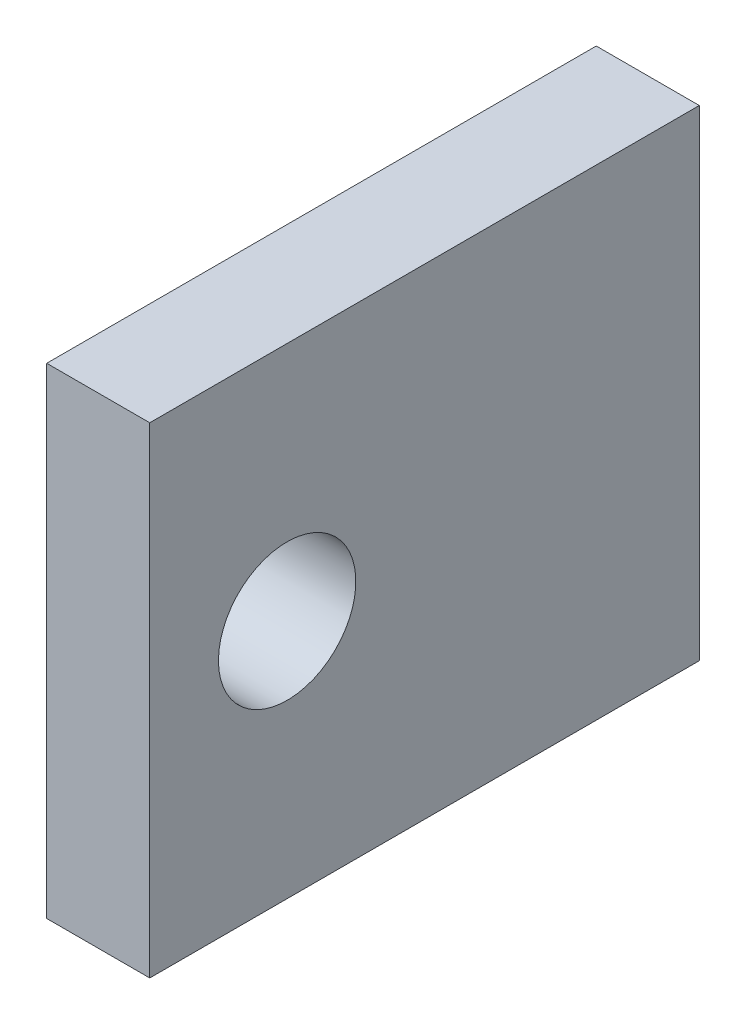
ISO-10303-21;
HEADER;
FILE_DESCRIPTION(('STEP AP214'),'2;1');
FILE_NAME('part.step','',(''),(''),'','','');
FILE_SCHEMA(('AUTOMOTIVE_DESIGN { 1 0 10303 214 1 1 1 1 }'));
ENDSEC;
DATA;
#1=APPLICATION_CONTEXT('core data for automotive mechanical design processes');
#2=APPLICATION_PROTOCOL_DEFINITION('international standard','automotive_design',2000,#1);
#3=PRODUCT_CONTEXT('',#1,'mechanical');
#4=PRODUCT('Part','Part','',(#3));
#5=PRODUCT_RELATED_PRODUCT_CATEGORY('part','',(#4));
#6=PRODUCT_DEFINITION_FORMATION('','',#4);
#7=PRODUCT_DEFINITION_CONTEXT('part definition',#1,'design');
#8=PRODUCT_DEFINITION('design','',#6,#7);
#9=PRODUCT_DEFINITION_SHAPE('','',#8);
#10=(LENGTH_UNIT() NAMED_UNIT(*) SI_UNIT(.MILLI.,.METRE.));
#11=(NAMED_UNIT(*) PLANE_ANGLE_UNIT() SI_UNIT($,.RADIAN.));
#12=(NAMED_UNIT(*) SI_UNIT($,.STERADIAN.) SOLID_ANGLE_UNIT());
#13=UNCERTAINTY_MEASURE_WITH_UNIT(LENGTH_MEASURE(1.E-05),#10,'distance_accuracy_value','');
#14=(GEOMETRIC_REPRESENTATION_CONTEXT(3) GLOBAL_UNCERTAINTY_ASSIGNED_CONTEXT((#13)) GLOBAL_UNIT_ASSIGNED_CONTEXT((#10,
#11,#12)) REPRESENTATION_CONTEXT('',''));
#15=CARTESIAN_POINT('',(0.,0.,0.));
#16=DIRECTION('',(0.,0.,1.));
#17=DIRECTION('',(1.,0.,0.));
#18=AXIS2_PLACEMENT_3D('',#15,#16,#17);
#19=CARTESIAN_POINT('',(9.525,0.,0.));
#20=DIRECTION('',(-1.,0.,0.));
#21=DIRECTION('',(0.,0.,1.));
#22=AXIS2_PLACEMENT_3D('',#19,#20,#21);
#23=PLANE('',#22);
#24=DIRECTION('',(0.,1.,0.));
#25=VECTOR('',#24,1.);
#26=CARTESIAN_POINT('',(9.525,-22.225,-25.4));
#27=LINE('',#26,#25);
#28=CARTESIAN_POINT('',(9.525,-22.225,-25.4));
#29=VERTEX_POINT('',#28);
#30=CARTESIAN_POINT('',(9.525,22.225,-25.4));
#31=VERTEX_POINT('',#30);
#32=EDGE_CURVE('E85',#29,#31,#27,.T.);
#33=ORIENTED_EDGE('',*,*,#32,.T.);
#34=DIRECTION('',(0.,0.,1.));
#35=VECTOR('',#34,1.);
#36=CARTESIAN_POINT('',(9.525,22.225,25.4));
#37=LINE('',#36,#35);
#38=CARTESIAN_POINT('',(9.525,22.225,25.4));
#39=VERTEX_POINT('',#38);
#40=EDGE_CURVE('E80',#31,#39,#37,.T.);
#41=ORIENTED_EDGE('',*,*,#40,.T.);
#42=DIRECTION('',(0.,-1.,0.));
#43=VECTOR('',#42,1.);
#44=CARTESIAN_POINT('',(9.525,-22.225,25.4));
#45=LINE('',#44,#43);
#46=CARTESIAN_POINT('',(9.525,-22.225,25.4));
#47=VERTEX_POINT('',#46);
#48=EDGE_CURVE('E83',#39,#47,#45,.T.);
#49=ORIENTED_EDGE('',*,*,#48,.T.);
#50=DIRECTION('',(0.,0.,-1.));
#51=VECTOR('',#50,1.);
#52=CARTESIAN_POINT('',(9.525,-22.225,25.4));
#53=LINE('',#52,#51);
#54=EDGE_CURVE('E50',#47,#29,#53,.T.);
#55=ORIENTED_EDGE('',*,*,#54,.T.);
#56=EDGE_LOOP('',(#33,#41,#49,#55));
#57=FACE_BOUND('',#56,.T.);
#58=CARTESIAN_POINT('',(9.525,0.,12.7));
#59=DIRECTION('',(1.,0.,0.));
#60=DIRECTION('',(0.,0.,-1.));
#61=AXIS2_PLACEMENT_3D('',#58,#59,#60);
#62=CIRCLE('',#61,6.35);
#63=CARTESIAN_POINT('',(9.525,0.,19.05));
#64=VERTEX_POINT('',#63);
#65=EDGE_CURVE('E100',#64,#64,#62,.T.);
#66=ORIENTED_EDGE('',*,*,#65,.F.);
#67=EDGE_LOOP('',(#66));
#68=FACE_BOUND('',#67,.T.);
#69=ADVANCED_FACE('F33',(#57,#68),#23,.F.);
#70=CARTESIAN_POINT('',(0.,0.,0.));
#71=DIRECTION('',(-1.,0.,0.));
#72=DIRECTION('',(0.,0.,1.));
#73=AXIS2_PLACEMENT_3D('',#70,#71,#72);
#74=PLANE('',#73);
#75=DIRECTION('',(0.,1.,0.));
#76=VECTOR('',#75,1.);
#77=CARTESIAN_POINT('',(0.,-22.225,-25.4));
#78=LINE('',#77,#76);
#79=CARTESIAN_POINT('',(0.,-22.225,-25.4));
#80=VERTEX_POINT('',#79);
#81=CARTESIAN_POINT('',(0.,22.225,-25.4));
#82=VERTEX_POINT('',#81);
#83=EDGE_CURVE('E97',#80,#82,#78,.T.);
#84=ORIENTED_EDGE('',*,*,#83,.F.);
#85=DIRECTION('',(0.,0.,-1.));
#86=VECTOR('',#85,1.);
#87=CARTESIAN_POINT('',(0.,-22.225,25.4));
#88=LINE('',#87,#86);
#89=CARTESIAN_POINT('',(0.,-22.225,25.4));
#90=VERTEX_POINT('',#89);
#91=EDGE_CURVE('E73',#90,#80,#88,.T.);
#92=ORIENTED_EDGE('',*,*,#91,.F.);
#93=DIRECTION('',(0.,-1.,0.));
#94=VECTOR('',#93,1.);
#95=CARTESIAN_POINT('',(0.,-22.225,25.4));
#96=LINE('',#95,#94);
#97=CARTESIAN_POINT('',(0.,22.225,25.4));
#98=VERTEX_POINT('',#97);
#99=EDGE_CURVE('E67',#98,#90,#96,.T.);
#100=ORIENTED_EDGE('',*,*,#99,.F.);
#101=DIRECTION('',(0.,0.,1.));
#102=VECTOR('',#101,1.);
#103=CARTESIAN_POINT('',(0.,22.225,25.4));
#104=LINE('',#103,#102);
#105=EDGE_CURVE('E89',#82,#98,#104,.T.);
#106=ORIENTED_EDGE('',*,*,#105,.F.);
#107=EDGE_LOOP('',(#84,#92,#100,#106));
#108=FACE_BOUND('',#107,.T.);
#109=CARTESIAN_POINT('',(0.,0.,12.7));
#110=DIRECTION('',(1.,0.,0.));
#111=DIRECTION('',(0.,0.,-1.));
#112=AXIS2_PLACEMENT_3D('',#109,#110,#111);
#113=CIRCLE('',#112,6.35);
#114=CARTESIAN_POINT('',(0.,0.,19.05));
#115=VERTEX_POINT('',#114);
#116=EDGE_CURVE('E112',#115,#115,#113,.T.);
#117=ORIENTED_EDGE('',*,*,#116,.T.);
#118=EDGE_LOOP('',(#117));
#119=FACE_BOUND('',#118,.T.);
#120=ADVANCED_FACE('F108',(#108,#119),#74,.T.);
#121=CARTESIAN_POINT('',(9.525,-22.225,-25.4));
#122=DIRECTION('',(0.,0.,1.));
#123=DIRECTION('',(1.,0.,0.));
#124=AXIS2_PLACEMENT_3D('',#121,#122,#123);
#125=PLANE('',#124);
#126=ORIENTED_EDGE('',*,*,#83,.T.);
#127=DIRECTION('',(-1.,0.,0.));
#128=VECTOR('',#127,1.);
#129=CARTESIAN_POINT('',(9.525,22.225,-25.4));
#130=LINE('',#129,#128);
#131=EDGE_CURVE('E11',#31,#82,#130,.T.);
#132=ORIENTED_EDGE('',*,*,#131,.F.);
#133=ORIENTED_EDGE('',*,*,#32,.F.);
#134=DIRECTION('',(-1.,0.,0.));
#135=VECTOR('',#134,1.);
#136=CARTESIAN_POINT('',(9.525,-22.225,-25.4));
#137=LINE('',#136,#135);
#138=EDGE_CURVE('E93',#29,#80,#137,.T.);
#139=ORIENTED_EDGE('',*,*,#138,.T.);
#140=EDGE_LOOP('',(#126,#132,#133,#139));
#141=FACE_BOUND('',#140,.T.);
#142=ADVANCED_FACE('F35',(#141),#125,.F.);
#143=CARTESIAN_POINT('',(9.525,22.225,25.4));
#144=DIRECTION('',(0.,-1.,0.));
#145=DIRECTION('',(0.,0.,-1.));
#146=AXIS2_PLACEMENT_3D('',#143,#144,#145);
#147=PLANE('',#146);
#148=ORIENTED_EDGE('',*,*,#105,.T.);
#149=DIRECTION('',(-1.,0.,0.));
#150=VECTOR('',#149,1.);
#151=CARTESIAN_POINT('',(9.525,22.225,25.4));
#152=LINE('',#151,#150);
#153=EDGE_CURVE('E42',#39,#98,#152,.T.);
#154=ORIENTED_EDGE('',*,*,#153,.F.);
#155=ORIENTED_EDGE('',*,*,#40,.F.);
#156=ORIENTED_EDGE('',*,*,#131,.T.);
#157=EDGE_LOOP('',(#148,#154,#155,#156));
#158=FACE_BOUND('',#157,.T.);
#159=ADVANCED_FACE('F88',(#158),#147,.F.);
#160=CARTESIAN_POINT('',(9.525,-22.225,25.4));
#161=DIRECTION('',(0.,0.,-1.));
#162=DIRECTION('',(-1.,0.,0.));
#163=AXIS2_PLACEMENT_3D('',#160,#161,#162);
#164=PLANE('',#163);
#165=ORIENTED_EDGE('',*,*,#99,.T.);
#166=DIRECTION('',(-1.,0.,0.));
#167=VECTOR('',#166,1.);
#168=CARTESIAN_POINT('',(9.525,-22.225,25.4));
#169=LINE('',#168,#167);
#170=EDGE_CURVE('E90',#47,#90,#169,.T.);
#171=ORIENTED_EDGE('',*,*,#170,.F.);
#172=ORIENTED_EDGE('',*,*,#48,.F.);
#173=ORIENTED_EDGE('',*,*,#153,.T.);
#174=EDGE_LOOP('',(#165,#171,#172,#173));
#175=FACE_BOUND('',#174,.T.);
#176=ADVANCED_FACE('F91',(#175),#164,.F.);
#177=CARTESIAN_POINT('',(9.525,-22.225,25.4));
#178=DIRECTION('',(0.,1.,0.));
#179=DIRECTION('',(0.,0.,1.));
#180=AXIS2_PLACEMENT_3D('',#177,#178,#179);
#181=PLANE('',#180);
#182=ORIENTED_EDGE('',*,*,#91,.T.);
#183=ORIENTED_EDGE('',*,*,#138,.F.);
#184=ORIENTED_EDGE('',*,*,#54,.F.);
#185=ORIENTED_EDGE('',*,*,#170,.T.);
#186=EDGE_LOOP('',(#182,#183,#184,#185));
#187=FACE_BOUND('',#186,.T.);
#188=ADVANCED_FACE('F105',(#187),#181,.F.);
#189=CARTESIAN_POINT('',(9.525,0.,12.7));
#190=DIRECTION('',(-1.,0.,0.));
#191=DIRECTION('',(0.,0.,1.));
#192=AXIS2_PLACEMENT_3D('',#189,#190,#191);
#193=CYLINDRICAL_SURFACE('',#192,6.35);
#194=CARTESIAN_POINT('',(9.525,0.,19.05));
#195=CARTESIAN_POINT('',(9.42578125,0.,19.05));
#196=CARTESIAN_POINT('',(9.3265625,0.,19.05));
#197=CARTESIAN_POINT('',(9.128125,0.,19.05));
#198=CARTESIAN_POINT('',(9.02890625,0.,19.05));
#199=CARTESIAN_POINT('',(8.83046875,0.,19.05));
#200=CARTESIAN_POINT('',(8.73125,0.,19.05));
#201=CARTESIAN_POINT('',(8.5328125,0.,19.05));
#202=CARTESIAN_POINT('',(8.43359375,0.,19.05));
#203=CARTESIAN_POINT('',(8.23515625,0.,19.05));
#204=CARTESIAN_POINT('',(8.1359375,0.,19.05));
#205=CARTESIAN_POINT('',(7.9375,0.,19.05));
#206=CARTESIAN_POINT('',(7.83828125,0.,19.05));
#207=CARTESIAN_POINT('',(7.63984375,0.,19.05));
#208=CARTESIAN_POINT('',(7.540625,0.,19.05));
#209=CARTESIAN_POINT('',(7.3421875,0.,19.05));
#210=CARTESIAN_POINT('',(7.24296875,0.,19.05));
#211=CARTESIAN_POINT('',(7.04453125,0.,19.05));
#212=CARTESIAN_POINT('',(6.9453125,0.,19.05));
#213=CARTESIAN_POINT('',(6.746875,0.,19.05));
#214=CARTESIAN_POINT('',(6.64765625,0.,19.05));
#215=CARTESIAN_POINT('',(6.44921875,0.,19.05));
#216=CARTESIAN_POINT('',(6.35,0.,19.05));
#217=CARTESIAN_POINT('',(6.1515625,0.,19.05));
#218=CARTESIAN_POINT('',(6.05234375,0.,19.05));
#219=CARTESIAN_POINT('',(5.85390625,0.,19.05));
#220=CARTESIAN_POINT('',(5.7546875,0.,19.05));
#221=CARTESIAN_POINT('',(5.55625,0.,19.05));
#222=CARTESIAN_POINT('',(5.45703125,0.,19.05));
#223=CARTESIAN_POINT('',(5.25859375,0.,19.05));
#224=CARTESIAN_POINT('',(5.159375,0.,19.05));
#225=CARTESIAN_POINT('',(4.9609375,0.,19.05));
#226=CARTESIAN_POINT('',(4.86171875,0.,19.05));
#227=CARTESIAN_POINT('',(4.66328125,0.,19.05));
#228=CARTESIAN_POINT('',(4.5640625,0.,19.05));
#229=CARTESIAN_POINT('',(4.365625,0.,19.05));
#230=CARTESIAN_POINT('',(4.26640625,0.,19.05));
#231=CARTESIAN_POINT('',(4.06796875,0.,19.05));
#232=CARTESIAN_POINT('',(3.96875,0.,19.05));
#233=CARTESIAN_POINT('',(3.7703125,0.,19.05));
#234=CARTESIAN_POINT('',(3.67109375,0.,19.05));
#235=CARTESIAN_POINT('',(3.47265625,0.,19.05));
#236=CARTESIAN_POINT('',(3.3734375,0.,19.05));
#237=CARTESIAN_POINT('',(3.175,0.,19.05));
#238=CARTESIAN_POINT('',(3.07578125,0.,19.05));
#239=CARTESIAN_POINT('',(2.87734375,0.,19.05));
#240=CARTESIAN_POINT('',(2.778125,0.,19.05));
#241=CARTESIAN_POINT('',(2.5796875,0.,19.05));
#242=CARTESIAN_POINT('',(2.48046875,0.,19.05));
#243=CARTESIAN_POINT('',(2.28203125,0.,19.05));
#244=CARTESIAN_POINT('',(2.1828125,0.,19.05));
#245=CARTESIAN_POINT('',(1.984375,0.,19.05));
#246=CARTESIAN_POINT('',(1.88515625,0.,19.05));
#247=CARTESIAN_POINT('',(1.68671875,0.,19.05));
#248=CARTESIAN_POINT('',(1.5875,0.,19.05));
#249=CARTESIAN_POINT('',(1.3890625,0.,19.05));
#250=CARTESIAN_POINT('',(1.28984375,0.,19.05));
#251=CARTESIAN_POINT('',(1.09140625,0.,19.05));
#252=CARTESIAN_POINT('',(0.992187500000001,0.,19.05));
#253=CARTESIAN_POINT('',(0.793750000000001,0.,19.05));
#254=CARTESIAN_POINT('',(0.69453125,0.,19.05));
#255=CARTESIAN_POINT('',(0.49609375,0.,19.05));
#256=CARTESIAN_POINT('',(0.396875,0.,19.05));
#257=CARTESIAN_POINT('',(0.1984375,0.,19.05));
#258=CARTESIAN_POINT('',(0.0992187500000001,0.,19.05));
#259=CARTESIAN_POINT('',(0.,0.,19.05));
#260=B_SPLINE_CURVE_WITH_KNOTS('',3,(#194,#195,#196,#197,#198,#199,#200,#201,#202,#203,#204,
#205,#206,#207,#208,#209,#210,#211,#212,#213,#214,#215,#216,#217,#218,#219,#220,#221,#222,#223,
#224,#225,#226,#227,#228,#229,#230,#231,#232,#233,#234,#235,#236,#237,#238,#239,#240,#241,#242,
#243,#244,#245,#246,#247,#248,#249,#250,#251,#252,#253,#254,#255,#256,#257,#258,#259),
.UNSPECIFIED.,.F.,.F.,(4,2,2,2,2,2,2,2,2,2,2,2,2,2,2,2,2,2,2,2,2,2,2,2,2,2,2,2,2,2,2,2,4),(0.,
0.297656249999998,0.595312499999999,0.892968749999999,1.190625,1.48828125,1.7859375,2.08359375,
2.38125,2.67890625,2.9765625,3.27421875,3.571875,3.86953125,4.1671875,4.46484375,4.7625,
5.06015625,5.3578125,5.65546875,5.953125,6.25078125,6.5484375,6.84609375,7.14375,7.44140625,
7.7390625,8.03671875,8.334375,8.63203125,8.9296875,9.22734375,9.525),.UNSPECIFIED.);
#261=EDGE_CURVE('BSEAM118',#64,#115,#260,.T.);
#262=ORIENTED_EDGE('',*,*,#65,.T.);
#263=ORIENTED_EDGE('',*,*,#116,.F.);
#264=ORIENTED_EDGE('',*,*,#261,.T.);
#265=ORIENTED_EDGE('',*,*,#261,.F.);
#266=EDGE_LOOP('',(#262,#264,#263,#265));
#267=FACE_BOUND('',#266,.T.);
#268=ADVANCED_FACE('F118',(#267),#193,.F.);
#269=CLOSED_SHELL('',(#69,#120,#142,#159,#176,#188,#268));
#270=MANIFOLD_SOLID_BREP('B2',#269);
#271=ADVANCED_BREP_SHAPE_REPRESENTATION('',(#18,#270),#14);
#272=SHAPE_DEFINITION_REPRESENTATION(#9,#271);
ENDSEC;
END-ISO-10303-21;
